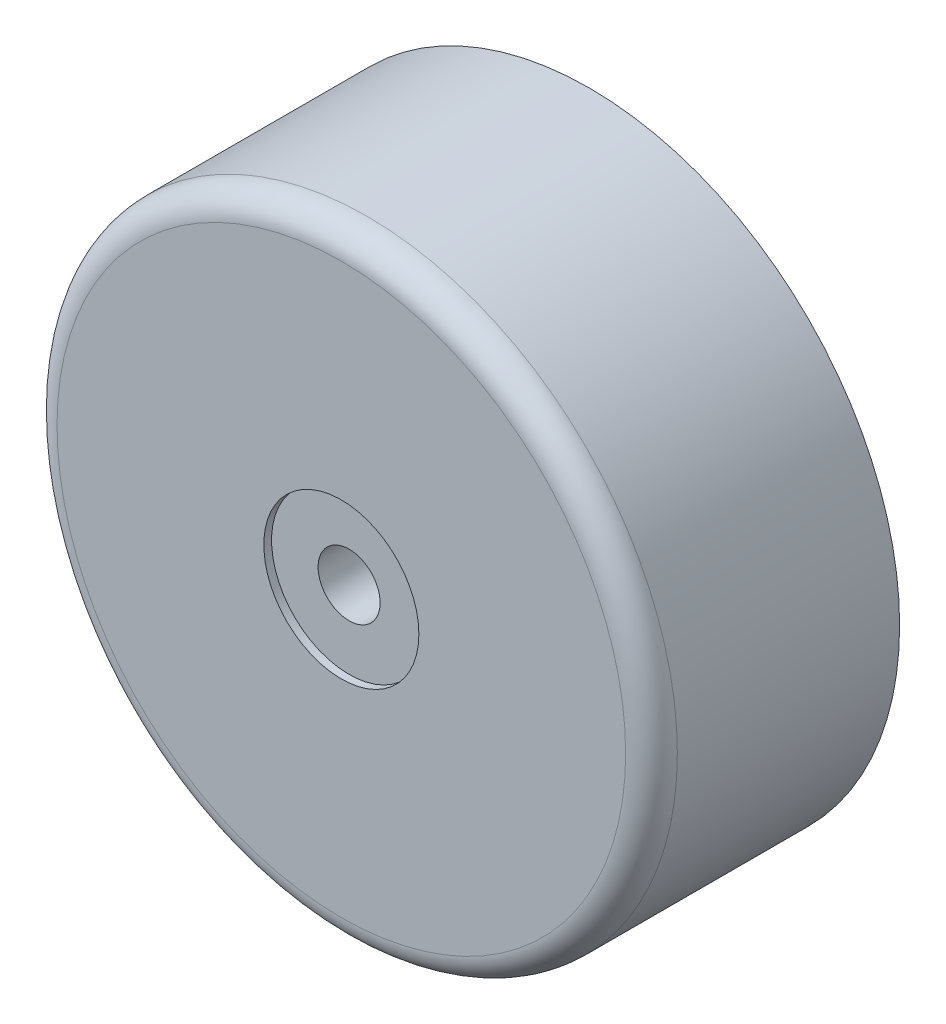
ISO-10303-21;
HEADER;
FILE_DESCRIPTION(('STEP AP214'),'2;1');
FILE_NAME('part.step','',(''),(''),'','','');
FILE_SCHEMA(('AUTOMOTIVE_DESIGN { 1 0 10303 214 1 1 1 1 }'));
ENDSEC;
DATA;
#1=APPLICATION_CONTEXT('core data for automotive mechanical design processes');
#2=APPLICATION_PROTOCOL_DEFINITION('international standard','automotive_design',2000,#1);
#3=PRODUCT_CONTEXT('',#1,'mechanical');
#4=PRODUCT('Part','Part','',(#3));
#5=PRODUCT_RELATED_PRODUCT_CATEGORY('part','',(#4));
#6=PRODUCT_DEFINITION_FORMATION('','',#4);
#7=PRODUCT_DEFINITION_CONTEXT('part definition',#1,'design');
#8=PRODUCT_DEFINITION('design','',#6,#7);
#9=PRODUCT_DEFINITION_SHAPE('','',#8);
#10=(LENGTH_UNIT() NAMED_UNIT(*) SI_UNIT(.MILLI.,.METRE.));
#11=(NAMED_UNIT(*) PLANE_ANGLE_UNIT() SI_UNIT($,.RADIAN.));
#12=(NAMED_UNIT(*) SI_UNIT($,.STERADIAN.) SOLID_ANGLE_UNIT());
#13=UNCERTAINTY_MEASURE_WITH_UNIT(LENGTH_MEASURE(1.E-05),#10,'distance_accuracy_value','');
#14=(GEOMETRIC_REPRESENTATION_CONTEXT(3) GLOBAL_UNCERTAINTY_ASSIGNED_CONTEXT((#13)) GLOBAL_UNIT_ASSIGNED_CONTEXT((#10,
#11,#12)) REPRESENTATION_CONTEXT('',''));
#15=CARTESIAN_POINT('',(0.,0.,0.));
#16=DIRECTION('',(0.,0.,1.));
#17=DIRECTION('',(1.,0.,0.));
#18=AXIS2_PLACEMENT_3D('',#15,#16,#17);
#19=CARTESIAN_POINT('',(0.,0.,0.1));
#20=DIRECTION('',(0.,0.,-1.));
#21=DIRECTION('',(-1.,0.,0.));
#22=AXIS2_PLACEMENT_3D('',#19,#20,#21);
#23=PLANE('',#22);
#24=CARTESIAN_POINT('',(-6.,0.,0.1));
#25=DIRECTION('',(0.,0.,-1.));
#26=DIRECTION('',(-1.,0.,0.));
#27=AXIS2_PLACEMENT_3D('',#24,#25,#26);
#28=CIRCLE('',#27,0.500000000000001);
#29=CARTESIAN_POINT('',(-6.5,0.,0.1));
#30=VERTEX_POINT('',#29);
#31=EDGE_CURVE('E62',#30,#30,#28,.T.);
#32=ORIENTED_EDGE('',*,*,#31,.F.);
#33=EDGE_LOOP('',(#32));
#34=FACE_BOUND('',#33,.T.);
#35=CARTESIAN_POINT('',(0.,0.,0.1));
#36=DIRECTION('',(0.,0.,-1.));
#37=DIRECTION('',(-1.,0.,0.));
#38=AXIS2_PLACEMENT_3D('',#35,#36,#37);
#39=CIRCLE('',#38,11.4);
#40=CARTESIAN_POINT('',(-11.4,0.,0.1));
#41=VERTEX_POINT('',#40);
#42=EDGE_CURVE('E48',#41,#41,#39,.T.);
#43=ORIENTED_EDGE('',*,*,#42,.T.);
#44=EDGE_LOOP('',(#43));
#45=FACE_BOUND('',#44,.T.);
#46=CARTESIAN_POINT('',(6.,0.,0.1));
#47=DIRECTION('',(0.,0.,-1.));
#48=DIRECTION('',(-1.,0.,0.));
#49=AXIS2_PLACEMENT_3D('',#46,#47,#48);
#50=CIRCLE('',#49,0.5);
#51=CARTESIAN_POINT('',(5.5,0.,0.1));
#52=VERTEX_POINT('',#51);
#53=EDGE_CURVE('E68',#52,#52,#50,.T.);
#54=ORIENTED_EDGE('',*,*,#53,.F.);
#55=EDGE_LOOP('',(#54));
#56=FACE_BOUND('',#55,.T.);
#57=ADVANCED_FACE('F33',(#34,#45,#56),#23,.T.);
#58=CARTESIAN_POINT('',(0.,0.,9.6));
#59=DIRECTION('',(0.,0.,-1.));
#60=DIRECTION('',(-1.,0.,0.));
#61=AXIS2_PLACEMENT_3D('',#58,#59,#60);
#62=CYLINDRICAL_SURFACE('',#61,12.);
#63=CARTESIAN_POINT('',(0.,0.,8.6));
#64=DIRECTION('',(0.,0.,1.));
#65=DIRECTION('',(1.,0.,0.));
#66=AXIS2_PLACEMENT_3D('',#63,#64,#65);
#67=CIRCLE('',#66,12.);
#68=CARTESIAN_POINT('',(12.,0.,8.6));
#69=VERTEX_POINT('',#68);
#70=EDGE_CURVE('E10',#69,#69,#67,.F.);
#71=ORIENTED_EDGE('',*,*,#70,.T.);
#72=EDGE_LOOP('',(#71));
#73=FACE_BOUND('',#72,.T.);
#74=CARTESIAN_POINT('',(0.,0.,0.));
#75=DIRECTION('',(0.,0.,1.));
#76=DIRECTION('',(1.,0.,0.));
#77=AXIS2_PLACEMENT_3D('',#74,#75,#76);
#78=CIRCLE('',#77,12.);
#79=CARTESIAN_POINT('',(12.,0.,0.));
#80=VERTEX_POINT('',#79);
#81=EDGE_CURVE('E44',#80,#80,#78,.T.);
#82=ORIENTED_EDGE('',*,*,#81,.T.);
#83=EDGE_LOOP('',(#82));
#84=FACE_BOUND('',#83,.T.);
#85=ADVANCED_FACE('F94',(#73,#84),#62,.T.);
#86=CARTESIAN_POINT('',(0.,0.,9.6));
#87=DIRECTION('',(0.,0.,1.));
#88=DIRECTION('',(1.,0.,0.));
#89=AXIS2_PLACEMENT_3D('',#86,#87,#88);
#90=PLANE('',#89);
#91=CARTESIAN_POINT('',(0.,0.,9.6));
#92=DIRECTION('',(0.,0.,1.));
#93=DIRECTION('',(1.,0.,0.));
#94=AXIS2_PLACEMENT_3D('',#91,#92,#93);
#95=CIRCLE('',#94,11.);
#96=CARTESIAN_POINT('',(11.,0.,9.6));
#97=VERTEX_POINT('',#96);
#98=EDGE_CURVE('E40',#97,#97,#95,.T.);
#99=ORIENTED_EDGE('',*,*,#98,.T.);
#100=EDGE_LOOP('',(#99));
#101=FACE_BOUND('',#100,.T.);
#102=CARTESIAN_POINT('',(0.,0.,9.6));
#103=DIRECTION('',(0.,0.,1.));
#104=DIRECTION('',(1.,0.,0.));
#105=AXIS2_PLACEMENT_3D('',#102,#103,#104);
#106=CIRCLE('',#105,3.);
#107=CARTESIAN_POINT('',(3.,0.,9.6));
#108=VERTEX_POINT('',#107);
#109=EDGE_CURVE('E75',#108,#108,#106,.T.);
#110=ORIENTED_EDGE('',*,*,#109,.F.);
#111=EDGE_LOOP('',(#110));
#112=FACE_BOUND('',#111,.T.);
#113=ADVANCED_FACE('F91',(#101,#112),#90,.T.);
#114=CARTESIAN_POINT('',(0.,0.,0.));
#115=DIRECTION('',(0.,0.,1.));
#116=DIRECTION('',(1.,0.,0.));
#117=AXIS2_PLACEMENT_3D('',#114,#115,#116);
#118=PLANE('',#117);
#119=CARTESIAN_POINT('',(0.,0.,0.));
#120=DIRECTION('',(0.,0.,-1.));
#121=DIRECTION('',(-1.,0.,0.));
#122=AXIS2_PLACEMENT_3D('',#119,#120,#121);
#123=CIRCLE('',#122,11.4);
#124=CARTESIAN_POINT('',(-11.4,0.,0.));
#125=VERTEX_POINT('',#124);
#126=EDGE_CURVE('E56',#125,#125,#123,.T.);
#127=ORIENTED_EDGE('',*,*,#126,.F.);
#128=EDGE_LOOP('',(#127));
#129=FACE_BOUND('',#128,.T.);
#130=ORIENTED_EDGE('',*,*,#81,.F.);
#131=EDGE_LOOP('',(#130));
#132=FACE_BOUND('',#131,.T.);
#133=ADVANCED_FACE('F93',(#129,#132),#118,.F.);
#134=CARTESIAN_POINT('',(0.,0.,0.1));
#135=DIRECTION('',(0.,0.,-1.));
#136=DIRECTION('',(-1.,0.,0.));
#137=AXIS2_PLACEMENT_3D('',#134,#135,#136);
#138=CYLINDRICAL_SURFACE('',#137,11.4);
#139=ORIENTED_EDGE('',*,*,#42,.F.);
#140=EDGE_LOOP('',(#139));
#141=FACE_BOUND('',#140,.T.);
#142=ORIENTED_EDGE('',*,*,#126,.T.);
#143=EDGE_LOOP('',(#142));
#144=FACE_BOUND('',#143,.T.);
#145=ADVANCED_FACE('F100',(#141,#144),#138,.F.);
#146=CARTESIAN_POINT('',(-6.,0.,-1.9));
#147=DIRECTION('',(0.,0.,1.));
#148=DIRECTION('',(1.,0.,0.));
#149=AXIS2_PLACEMENT_3D('',#146,#147,#148);
#150=CYLINDRICAL_SURFACE('',#149,0.500000000000001);
#151=CARTESIAN_POINT('',(-6.,0.,-1.9));
#152=DIRECTION('',(0.,0.,-1.));
#153=DIRECTION('',(-1.,0.,0.));
#154=AXIS2_PLACEMENT_3D('',#151,#152,#153);
#155=CIRCLE('',#154,0.500000000000001);
#156=CARTESIAN_POINT('',(-6.5,0.,-1.9));
#157=VERTEX_POINT('',#156);
#158=EDGE_CURVE('E59',#157,#157,#155,.T.);
#159=ORIENTED_EDGE('',*,*,#158,.F.);
#160=EDGE_LOOP('',(#159));
#161=FACE_BOUND('',#160,.T.);
#162=ORIENTED_EDGE('',*,*,#31,.T.);
#163=EDGE_LOOP('',(#162));
#164=FACE_BOUND('',#163,.T.);
#165=ADVANCED_FACE('F112',(#161,#164),#150,.T.);
#166=CARTESIAN_POINT('',(-6.,0.,-1.9));
#167=DIRECTION('',(0.,0.,-1.));
#168=DIRECTION('',(-1.,0.,0.));
#169=AXIS2_PLACEMENT_3D('',#166,#167,#168);
#170=PLANE('',#169);
#171=ORIENTED_EDGE('',*,*,#158,.T.);
#172=EDGE_LOOP('',(#171));
#173=FACE_BOUND('',#172,.T.);
#174=ADVANCED_FACE('F119',(#173),#170,.T.);
#175=CARTESIAN_POINT('',(6.,0.,-1.9));
#176=DIRECTION('',(0.,0.,1.));
#177=DIRECTION('',(1.,0.,0.));
#178=AXIS2_PLACEMENT_3D('',#175,#176,#177);
#179=CYLINDRICAL_SURFACE('',#178,0.5);
#180=CARTESIAN_POINT('',(6.,0.,-1.9));
#181=DIRECTION('',(0.,0.,-1.));
#182=DIRECTION('',(-1.,0.,0.));
#183=AXIS2_PLACEMENT_3D('',#180,#181,#182);
#184=CIRCLE('',#183,0.5);
#185=CARTESIAN_POINT('',(5.5,0.,-1.9));
#186=VERTEX_POINT('',#185);
#187=EDGE_CURVE('E65',#186,#186,#184,.T.);
#188=ORIENTED_EDGE('',*,*,#187,.F.);
#189=EDGE_LOOP('',(#188));
#190=FACE_BOUND('',#189,.T.);
#191=ORIENTED_EDGE('',*,*,#53,.T.);
#192=EDGE_LOOP('',(#191));
#193=FACE_BOUND('',#192,.T.);
#194=ADVANCED_FACE('F130',(#190,#193),#179,.T.);
#195=CARTESIAN_POINT('',(6.,0.,-1.9));
#196=DIRECTION('',(0.,0.,-1.));
#197=DIRECTION('',(-1.,0.,0.));
#198=AXIS2_PLACEMENT_3D('',#195,#196,#197);
#199=PLANE('',#198);
#200=ORIENTED_EDGE('',*,*,#187,.T.);
#201=EDGE_LOOP('',(#200));
#202=FACE_BOUND('',#201,.T.);
#203=ADVANCED_FACE('F132',(#202),#199,.T.);
#204=CARTESIAN_POINT('',(0.,0.,9.3));
#205=DIRECTION('',(0.,0.,1.));
#206=DIRECTION('',(1.,0.,0.));
#207=AXIS2_PLACEMENT_3D('',#204,#205,#206);
#208=PLANE('',#207);
#209=CARTESIAN_POINT('',(0.,0.,9.3));
#210=DIRECTION('',(0.,0.,1.));
#211=DIRECTION('',(1.,0.,0.));
#212=AXIS2_PLACEMENT_3D('',#209,#210,#211);
#213=CIRCLE('',#212,3.);
#214=CARTESIAN_POINT('',(3.,0.,9.3));
#215=VERTEX_POINT('',#214);
#216=EDGE_CURVE('E54',#215,#215,#213,.T.);
#217=ORIENTED_EDGE('',*,*,#216,.T.);
#218=EDGE_LOOP('',(#217));
#219=FACE_BOUND('',#218,.T.);
#220=CARTESIAN_POINT('',(0.,0.,9.3));
#221=DIRECTION('',(0.,0.,1.));
#222=DIRECTION('',(1.,0.,0.));
#223=AXIS2_PLACEMENT_3D('',#220,#221,#222);
#224=CIRCLE('',#223,1.2);
#225=CARTESIAN_POINT('',(1.2,0.,9.3));
#226=VERTEX_POINT('',#225);
#227=EDGE_CURVE('E51',#226,#226,#224,.F.);
#228=ORIENTED_EDGE('',*,*,#227,.T.);
#229=EDGE_LOOP('',(#228));
#230=FACE_BOUND('',#229,.T.);
#231=ADVANCED_FACE('F81',(#219,#230),#208,.T.);
#232=CARTESIAN_POINT('',(0.,0.,9.3));
#233=DIRECTION('',(0.,0.,1.));
#234=DIRECTION('',(1.,0.,0.));
#235=AXIS2_PLACEMENT_3D('',#232,#233,#234);
#236=CYLINDRICAL_SURFACE('',#235,3.);
#237=ORIENTED_EDGE('',*,*,#216,.F.);
#238=EDGE_LOOP('',(#237));
#239=FACE_BOUND('',#238,.T.);
#240=ORIENTED_EDGE('',*,*,#109,.T.);
#241=EDGE_LOOP('',(#240));
#242=FACE_BOUND('',#241,.T.);
#243=ADVANCED_FACE('F84',(#239,#242),#236,.F.);
#244=CARTESIAN_POINT('',(0.,0.,7.6));
#245=DIRECTION('',(0.,0.,1.));
#246=DIRECTION('',(1.,0.,0.));
#247=AXIS2_PLACEMENT_3D('',#244,#245,#246);
#248=PLANE('',#247);
#249=CARTESIAN_POINT('',(0.,0.,7.6));
#250=DIRECTION('',(0.,0.,1.));
#251=DIRECTION('',(1.,0.,0.));
#252=AXIS2_PLACEMENT_3D('',#249,#250,#251);
#253=CIRCLE('',#252,1.2);
#254=CARTESIAN_POINT('',(1.2,0.,7.6));
#255=VERTEX_POINT('',#254);
#256=EDGE_CURVE('E53',#255,#255,#253,.T.);
#257=ORIENTED_EDGE('',*,*,#256,.T.);
#258=EDGE_LOOP('',(#257));
#259=FACE_BOUND('',#258,.T.);
#260=ADVANCED_FACE('F87',(#259),#248,.T.);
#261=CARTESIAN_POINT('',(0.,0.,7.6));
#262=DIRECTION('',(0.,0.,1.));
#263=DIRECTION('',(1.,0.,0.));
#264=AXIS2_PLACEMENT_3D('',#261,#262,#263);
#265=CYLINDRICAL_SURFACE('',#264,1.2);
#266=ORIENTED_EDGE('',*,*,#256,.F.);
#267=EDGE_LOOP('',(#266));
#268=FACE_BOUND('',#267,.T.);
#269=ORIENTED_EDGE('',*,*,#227,.F.);
#270=EDGE_LOOP('',(#269));
#271=FACE_BOUND('',#270,.T.);
#272=ADVANCED_FACE('F144',(#268,#271),#265,.F.);
#273=CARTESIAN_POINT('',(0.,0.,8.6));
#274=DIRECTION('',(0.,0.,1.));
#275=DIRECTION('',(1.,0.,0.));
#276=AXIS2_PLACEMENT_3D('',#273,#274,#275);
#277=TOROIDAL_SURFACE('',#276,11.,1.);
#278=ORIENTED_EDGE('',*,*,#70,.F.);
#279=EDGE_LOOP('',(#278));
#280=FACE_BOUND('',#279,.T.);
#281=ORIENTED_EDGE('',*,*,#98,.F.);
#282=EDGE_LOOP('',(#281));
#283=FACE_BOUND('',#282,.T.);
#284=ADVANCED_FACE('F35',(#280,#283),#277,.T.);
#285=CLOSED_SHELL('',(#57,#85,#113,#133,#145,#165,#174,#194,#203,#231,#243,#260,#272,#284));
#286=MANIFOLD_SOLID_BREP('B2',#285);
#287=ADVANCED_BREP_SHAPE_REPRESENTATION('',(#18,#286),#14);
#288=SHAPE_DEFINITION_REPRESENTATION(#9,#287);
ENDSEC;
END-ISO-10303-21;
